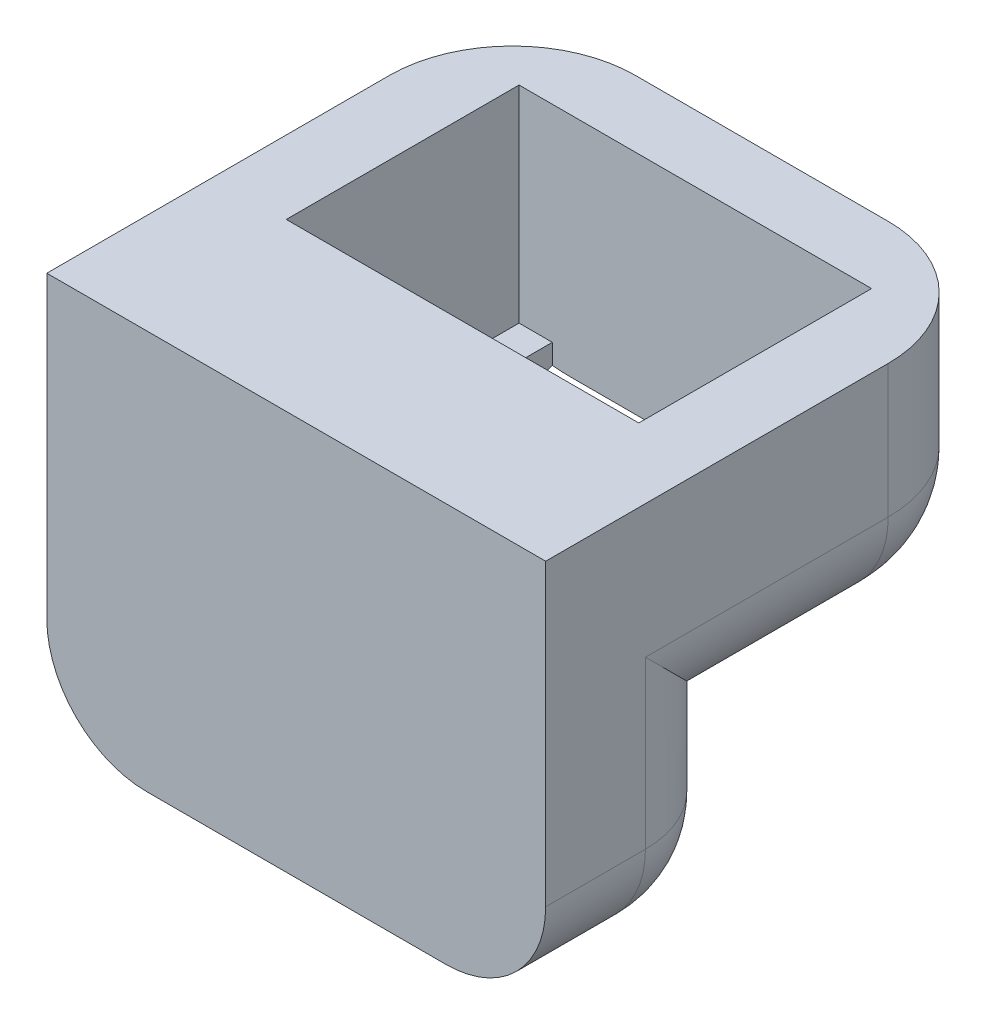
ISO-10303-21;
HEADER;
FILE_DESCRIPTION(('STEP AP214'),'2;1');
FILE_NAME('part.step','',(''),(''),'','','');
FILE_SCHEMA(('AUTOMOTIVE_DESIGN { 1 0 10303 214 1 1 1 1 }'));
ENDSEC;
DATA;
#1=APPLICATION_CONTEXT('core data for automotive mechanical design processes');
#2=APPLICATION_PROTOCOL_DEFINITION('international standard','automotive_design',2000,#1);
#3=PRODUCT_CONTEXT('',#1,'mechanical');
#4=PRODUCT('Part','Part','',(#3));
#5=PRODUCT_RELATED_PRODUCT_CATEGORY('part','',(#4));
#6=PRODUCT_DEFINITION_FORMATION('','',#4);
#7=PRODUCT_DEFINITION_CONTEXT('part definition',#1,'design');
#8=PRODUCT_DEFINITION('design','',#6,#7);
#9=PRODUCT_DEFINITION_SHAPE('','',#8);
#10=(LENGTH_UNIT() NAMED_UNIT(*) SI_UNIT(.MILLI.,.METRE.));
#11=(NAMED_UNIT(*) PLANE_ANGLE_UNIT() SI_UNIT($,.RADIAN.));
#12=(NAMED_UNIT(*) SI_UNIT($,.STERADIAN.) SOLID_ANGLE_UNIT());
#13=UNCERTAINTY_MEASURE_WITH_UNIT(LENGTH_MEASURE(1.E-05),#10,'distance_accuracy_value','');
#14=(GEOMETRIC_REPRESENTATION_CONTEXT(3) GLOBAL_UNCERTAINTY_ASSIGNED_CONTEXT((#13)) GLOBAL_UNIT_ASSIGNED_CONTEXT((#10,
#11,#12)) REPRESENTATION_CONTEXT('',''));
#15=CARTESIAN_POINT('',(0.,0.,0.));
#16=DIRECTION('',(0.,0.,1.));
#17=DIRECTION('',(1.,0.,0.));
#18=AXIS2_PLACEMENT_3D('',#15,#16,#17);
#19=CARTESIAN_POINT('',(0.,0.,0.));
#20=DIRECTION('',(0.,1.,0.));
#21=DIRECTION('',(0.,0.,1.));
#22=AXIS2_PLACEMENT_3D('',#19,#20,#21);
#23=PLANE('',#22);
#24=DIRECTION('',(1.,0.,0.));
#25=VECTOR('',#24,1.);
#26=CARTESIAN_POINT('',(-7.5,0.,1.));
#27=LINE('',#26,#25);
#28=CARTESIAN_POINT('',(-4.5,0.,1.));
#29=VERTEX_POINT('',#28);
#30=CARTESIAN_POINT('',(-4.3,0.,1.));
#31=VERTEX_POINT('',#30);
#32=EDGE_CURVE('E204',#29,#31,#27,.T.);
#33=ORIENTED_EDGE('',*,*,#32,.F.);
#34=DIRECTION('',(0.,0.,1.));
#35=VECTOR('',#34,1.);
#36=CARTESIAN_POINT('',(-4.5,0.,0.));
#37=LINE('',#36,#35);
#38=CARTESIAN_POINT('',(-4.5,0.,-3.3));
#39=VERTEX_POINT('',#38);
#40=EDGE_CURVE('E361',#29,#39,#37,.F.);
#41=ORIENTED_EDGE('',*,*,#40,.T.);
#42=CARTESIAN_POINT('',(-3.8,0.,-3.3));
#43=DIRECTION('',(0.,1.,0.));
#44=DIRECTION('',(0.,0.,1.));
#45=AXIS2_PLACEMENT_3D('',#42,#43,#44);
#46=CIRCLE('',#45,0.7);
#47=CARTESIAN_POINT('',(-4.3,0.,-3.78989794855663));
#48=VERTEX_POINT('',#47);
#49=EDGE_CURVE('E206',#39,#48,#46,.F.);
#50=ORIENTED_EDGE('',*,*,#49,.T.);
#51=DIRECTION('',(0.,0.,1.));
#52=VECTOR('',#51,1.);
#53=CARTESIAN_POINT('',(-4.3,0.,-5.));
#54=LINE('',#53,#52);
#55=EDGE_CURVE('E202',#48,#31,#54,.T.);
#56=ORIENTED_EDGE('',*,*,#55,.T.);
#57=EDGE_LOOP('',(#33,#41,#50,#56));
#58=FACE_BOUND('',#57,.T.);
#59=ADVANCED_FACE('F44',(#58),#23,.F.);
#60=CARTESIAN_POINT('',(3.8,0.,-3.3));
#61=DIRECTION('',(0.,1.,0.));
#62=DIRECTION('',(0.,0.,1.));
#63=AXIS2_PLACEMENT_3D('',#60,#61,#62);
#64=CIRCLE('',#63,0.7);
#65=CARTESIAN_POINT('',(4.3,0.,-3.78989794855664));
#66=VERTEX_POINT('',#65);
#67=CARTESIAN_POINT('',(4.5,0.,-3.3));
#68=VERTEX_POINT('',#67);
#69=EDGE_CURVE('E353',#66,#68,#64,.F.);
#70=ORIENTED_EDGE('',*,*,#69,.T.);
#71=DIRECTION('',(0.,0.,-1.));
#72=VECTOR('',#71,1.);
#73=CARTESIAN_POINT('',(4.5,0.,0.));
#74=LINE('',#73,#72);
#75=CARTESIAN_POINT('',(4.5,0.,1.));
#76=VERTEX_POINT('',#75);
#77=EDGE_CURVE('E357',#68,#76,#74,.F.);
#78=ORIENTED_EDGE('',*,*,#77,.T.);
#79=CARTESIAN_POINT('',(4.3,0.,1.));
#80=VERTEX_POINT('',#79);
#81=EDGE_CURVE('E227',#80,#76,#27,.T.);
#82=ORIENTED_EDGE('',*,*,#81,.F.);
#83=DIRECTION('',(0.,0.,-1.));
#84=VECTOR('',#83,1.);
#85=CARTESIAN_POINT('',(4.3,0.,-5.));
#86=LINE('',#85,#84);
#87=EDGE_CURVE('E214',#80,#66,#86,.T.);
#88=ORIENTED_EDGE('',*,*,#87,.T.);
#89=EDGE_LOOP('',(#70,#78,#82,#88));
#90=FACE_BOUND('',#89,.T.);
#91=ADVANCED_FACE('F447',(#90),#23,.F.);
#92=CARTESIAN_POINT('',(7.5,7.,-7.));
#93=DIRECTION('',(-1.,0.,0.));
#94=DIRECTION('',(0.,0.,1.));
#95=AXIS2_PLACEMENT_3D('',#92,#93,#94);
#96=PLANE('',#95);
#97=DIRECTION('',(0.,0.,1.));
#98=VECTOR('',#97,1.);
#99=CARTESIAN_POINT('',(7.5,-2.,-7.));
#100=LINE('',#99,#98);
#101=CARTESIAN_POINT('',(7.5,-2.,7.));
#102=VERTEX_POINT('',#101);
#103=CARTESIAN_POINT('',(7.5,-2.,4.));
#104=VERTEX_POINT('',#103);
#105=EDGE_CURVE('E350',#102,#104,#100,.F.);
#106=ORIENTED_EDGE('',*,*,#105,.T.);
#107=DIRECTION('',(0.,1.,0.));
#108=VECTOR('',#107,1.);
#109=CARTESIAN_POINT('',(7.5,7.,4.));
#110=LINE('',#109,#108);
#111=CARTESIAN_POINT('',(7.5,3.,4.));
#112=VERTEX_POINT('',#111);
#113=EDGE_CURVE('E532',#104,#112,#110,.T.);
#114=ORIENTED_EDGE('',*,*,#113,.T.);
#115=DIRECTION('',(0.,0.,-1.));
#116=VECTOR('',#115,1.);
#117=CARTESIAN_POINT('',(7.5,3.,-7.));
#118=LINE('',#117,#116);
#119=CARTESIAN_POINT('',(7.5,3.,-3.3));
#120=VERTEX_POINT('',#119);
#121=EDGE_CURVE('E68',#112,#120,#118,.T.);
#122=ORIENTED_EDGE('',*,*,#121,.T.);
#123=DIRECTION('',(0.,-1.,0.));
#124=VECTOR('',#123,1.);
#125=CARTESIAN_POINT('',(7.5,7.,-3.3));
#126=LINE('',#125,#124);
#127=CARTESIAN_POINT('',(7.5,7.,-3.3));
#128=VERTEX_POINT('',#127);
#129=EDGE_CURVE('E326',#120,#128,#126,.F.);
#130=ORIENTED_EDGE('',*,*,#129,.T.);
#131=DIRECTION('',(0.,0.,-1.));
#132=VECTOR('',#131,1.);
#133=CARTESIAN_POINT('',(7.5,7.,-7.));
#134=LINE('',#133,#132);
#135=CARTESIAN_POINT('',(7.5,7.,7.));
#136=VERTEX_POINT('',#135);
#137=EDGE_CURVE('E282',#136,#128,#134,.T.);
#138=ORIENTED_EDGE('',*,*,#137,.F.);
#139=DIRECTION('',(0.,-1.,0.));
#140=VECTOR('',#139,1.);
#141=CARTESIAN_POINT('',(7.5,7.,7.));
#142=LINE('',#141,#140);
#143=EDGE_CURVE('E302',#136,#102,#142,.T.);
#144=ORIENTED_EDGE('',*,*,#143,.T.);
#145=EDGE_LOOP('',(#106,#114,#122,#130,#138,#144));
#146=FACE_BOUND('',#145,.T.);
#147=ADVANCED_FACE('F448',(#146),#96,.F.);
#148=CARTESIAN_POINT('',(-7.5,7.,-7.));
#149=DIRECTION('',(0.,0.,1.));
#150=DIRECTION('',(1.,0.,0.));
#151=AXIS2_PLACEMENT_3D('',#148,#149,#150);
#152=PLANE('',#151);
#153=DIRECTION('',(0.,-1.,0.));
#154=VECTOR('',#153,1.);
#155=CARTESIAN_POINT('',(3.8,7.,-7.));
#156=LINE('',#155,#154);
#157=CARTESIAN_POINT('',(3.8,7.,-7.));
#158=VERTEX_POINT('',#157);
#159=CARTESIAN_POINT('',(3.8,3.,-7.));
#160=VERTEX_POINT('',#159);
#161=EDGE_CURVE('E317',#158,#160,#156,.T.);
#162=ORIENTED_EDGE('',*,*,#161,.T.);
#163=DIRECTION('',(-1.,0.,0.));
#164=VECTOR('',#163,1.);
#165=CARTESIAN_POINT('',(-7.5,3.,-7.));
#166=LINE('',#165,#164);
#167=CARTESIAN_POINT('',(-3.8,3.,-7.));
#168=VERTEX_POINT('',#167);
#169=EDGE_CURVE('E508',#160,#168,#166,.T.);
#170=ORIENTED_EDGE('',*,*,#169,.T.);
#171=DIRECTION('',(0.,-1.,0.));
#172=VECTOR('',#171,1.);
#173=CARTESIAN_POINT('',(-3.8,7.,-7.));
#174=LINE('',#173,#172);
#175=CARTESIAN_POINT('',(-3.8,7.,-7.));
#176=VERTEX_POINT('',#175);
#177=EDGE_CURVE('E318',#168,#176,#174,.F.);
#178=ORIENTED_EDGE('',*,*,#177,.T.);
#179=DIRECTION('',(-1.,0.,0.));
#180=VECTOR('',#179,1.);
#181=CARTESIAN_POINT('',(-7.5,7.,-7.));
#182=LINE('',#181,#180);
#183=EDGE_CURVE('E295',#158,#176,#182,.T.);
#184=ORIENTED_EDGE('',*,*,#183,.F.);
#185=EDGE_LOOP('',(#162,#170,#178,#184));
#186=FACE_BOUND('',#185,.T.);
#187=ADVANCED_FACE('F462',(#186),#152,.F.);
#188=CARTESIAN_POINT('',(-7.5,7.,-7.));
#189=DIRECTION('',(1.,0.,0.));
#190=DIRECTION('',(0.,0.,-1.));
#191=AXIS2_PLACEMENT_3D('',#188,#189,#190);
#192=PLANE('',#191);
#193=DIRECTION('',(0.,0.,1.));
#194=VECTOR('',#193,1.);
#195=CARTESIAN_POINT('',(-7.5,3.,-7.));
#196=LINE('',#195,#194);
#197=CARTESIAN_POINT('',(-7.5,3.,-3.3));
#198=VERTEX_POINT('',#197);
#199=CARTESIAN_POINT('',(-7.5,3.,4.));
#200=VERTEX_POINT('',#199);
#201=EDGE_CURVE('E351',#198,#200,#196,.T.);
#202=ORIENTED_EDGE('',*,*,#201,.T.);
#203=DIRECTION('',(0.,1.,0.));
#204=VECTOR('',#203,1.);
#205=CARTESIAN_POINT('',(-7.5,7.,4.));
#206=LINE('',#205,#204);
#207=CARTESIAN_POINT('',(-7.5,-2.,4.));
#208=VERTEX_POINT('',#207);
#209=EDGE_CURVE('E523',#200,#208,#206,.F.);
#210=ORIENTED_EDGE('',*,*,#209,.T.);
#211=DIRECTION('',(0.,0.,-1.));
#212=VECTOR('',#211,1.);
#213=CARTESIAN_POINT('',(-7.5,-2.,-7.));
#214=LINE('',#213,#212);
#215=CARTESIAN_POINT('',(-7.5,-2.,7.));
#216=VERTEX_POINT('',#215);
#217=EDGE_CURVE('E336',#208,#216,#214,.F.);
#218=ORIENTED_EDGE('',*,*,#217,.T.);
#219=DIRECTION('',(0.,-1.,0.));
#220=VECTOR('',#219,1.);
#221=CARTESIAN_POINT('',(-7.5,7.,7.));
#222=LINE('',#221,#220);
#223=CARTESIAN_POINT('',(-7.5,7.,7.));
#224=VERTEX_POINT('',#223);
#225=EDGE_CURVE('E308',#224,#216,#222,.T.);
#226=ORIENTED_EDGE('',*,*,#225,.F.);
#227=DIRECTION('',(0.,0.,1.));
#228=VECTOR('',#227,1.);
#229=CARTESIAN_POINT('',(-7.5,7.,-7.));
#230=LINE('',#229,#228);
#231=CARTESIAN_POINT('',(-7.5,7.,-3.3));
#232=VERTEX_POINT('',#231);
#233=EDGE_CURVE('E296',#232,#224,#230,.T.);
#234=ORIENTED_EDGE('',*,*,#233,.F.);
#235=DIRECTION('',(0.,-1.,0.));
#236=VECTOR('',#235,1.);
#237=CARTESIAN_POINT('',(-7.5,7.,-3.3));
#238=LINE('',#237,#236);
#239=EDGE_CURVE('E315',#232,#198,#238,.T.);
#240=ORIENTED_EDGE('',*,*,#239,.T.);
#241=EDGE_LOOP('',(#202,#210,#218,#226,#234,#240));
#242=FACE_BOUND('',#241,.T.);
#243=ADVANCED_FACE('F456',(#242),#192,.F.);
#244=CARTESIAN_POINT('',(-7.5,7.,7.));
#245=DIRECTION('',(0.,0.,-1.));
#246=DIRECTION('',(-1.,0.,0.));
#247=AXIS2_PLACEMENT_3D('',#244,#245,#246);
#248=PLANE('',#247);
#249=ORIENTED_EDGE('',*,*,#225,.T.);
#250=CARTESIAN_POINT('',(-4.5,-2.,7.));
#251=DIRECTION('',(0.,0.,-1.));
#252=DIRECTION('',(-1.,0.,0.));
#253=AXIS2_PLACEMENT_3D('',#250,#251,#252);
#254=CIRCLE('',#253,3.);
#255=CARTESIAN_POINT('',(-4.5,-5.,7.));
#256=VERTEX_POINT('',#255);
#257=EDGE_CURVE('E343',#216,#256,#254,.F.);
#258=ORIENTED_EDGE('',*,*,#257,.T.);
#259=DIRECTION('',(-1.,0.,0.));
#260=VECTOR('',#259,1.);
#261=CARTESIAN_POINT('',(-7.5,-5.,7.));
#262=LINE('',#261,#260);
#263=CARTESIAN_POINT('',(4.5,-5.,7.));
#264=VERTEX_POINT('',#263);
#265=EDGE_CURVE('E223',#264,#256,#262,.T.);
#266=ORIENTED_EDGE('',*,*,#265,.F.);
#267=CARTESIAN_POINT('',(4.5,-2.,7.));
#268=DIRECTION('',(0.,0.,-1.));
#269=DIRECTION('',(-1.,0.,0.));
#270=AXIS2_PLACEMENT_3D('',#267,#268,#269);
#271=CIRCLE('',#270,3.);
#272=EDGE_CURVE('E341',#264,#102,#271,.F.);
#273=ORIENTED_EDGE('',*,*,#272,.T.);
#274=ORIENTED_EDGE('',*,*,#143,.F.);
#275=DIRECTION('',(1.,0.,0.));
#276=VECTOR('',#275,1.);
#277=CARTESIAN_POINT('',(-7.5,7.,7.));
#278=LINE('',#277,#276);
#279=EDGE_CURVE('E301',#224,#136,#278,.T.);
#280=ORIENTED_EDGE('',*,*,#279,.F.);
#281=EDGE_LOOP('',(#249,#258,#266,#273,#274,#280));
#282=FACE_BOUND('',#281,.T.);
#283=ADVANCED_FACE('F457',(#282),#248,.F.);
#284=CARTESIAN_POINT('',(0.,7.,0.));
#285=DIRECTION('',(0.,1.,0.));
#286=DIRECTION('',(0.,0.,1.));
#287=AXIS2_PLACEMENT_3D('',#284,#285,#286);
#288=PLANE('',#287);
#289=DIRECTION('',(0.,0.,1.));
#290=VECTOR('',#289,1.);
#291=CARTESIAN_POINT('',(-5.3,7.,-5.));
#292=LINE('',#291,#290);
#293=CARTESIAN_POINT('',(-5.3,7.,-5.));
#294=VERTEX_POINT('',#293);
#295=CARTESIAN_POINT('',(-5.3,7.,2.));
#296=VERTEX_POINT('',#295);
#297=EDGE_CURVE('E261',#294,#296,#292,.T.);
#298=ORIENTED_EDGE('',*,*,#297,.F.);
#299=DIRECTION('',(-1.,0.,0.));
#300=VECTOR('',#299,1.);
#301=CARTESIAN_POINT('',(-5.3,7.,-5.));
#302=LINE('',#301,#300);
#303=CARTESIAN_POINT('',(5.3,7.,-5.));
#304=VERTEX_POINT('',#303);
#305=EDGE_CURVE('E252',#304,#294,#302,.T.);
#306=ORIENTED_EDGE('',*,*,#305,.F.);
#307=DIRECTION('',(0.,0.,-1.));
#308=VECTOR('',#307,1.);
#309=CARTESIAN_POINT('',(5.3,7.,-5.));
#310=LINE('',#309,#308);
#311=CARTESIAN_POINT('',(5.3,7.,2.));
#312=VERTEX_POINT('',#311);
#313=EDGE_CURVE('E272',#312,#304,#310,.T.);
#314=ORIENTED_EDGE('',*,*,#313,.F.);
#315=DIRECTION('',(1.,0.,0.));
#316=VECTOR('',#315,1.);
#317=CARTESIAN_POINT('',(-5.3,7.,2.));
#318=LINE('',#317,#316);
#319=EDGE_CURVE('E266',#296,#312,#318,.T.);
#320=ORIENTED_EDGE('',*,*,#319,.F.);
#321=EDGE_LOOP('',(#298,#306,#314,#320));
#322=FACE_BOUND('',#321,.T.);
#323=ORIENTED_EDGE('',*,*,#183,.T.);
#324=CARTESIAN_POINT('',(-3.8,7.,-3.3));
#325=DIRECTION('',(0.,1.,0.));
#326=DIRECTION('',(0.,0.,1.));
#327=AXIS2_PLACEMENT_3D('',#324,#325,#326);
#328=CIRCLE('',#327,3.7);
#329=EDGE_CURVE('E327',#176,#232,#328,.T.);
#330=ORIENTED_EDGE('',*,*,#329,.T.);
#331=ORIENTED_EDGE('',*,*,#233,.T.);
#332=ORIENTED_EDGE('',*,*,#279,.T.);
#333=ORIENTED_EDGE('',*,*,#137,.T.);
#334=CARTESIAN_POINT('',(3.8,7.,-3.3));
#335=DIRECTION('',(0.,1.,0.));
#336=DIRECTION('',(0.,0.,1.));
#337=AXIS2_PLACEMENT_3D('',#334,#335,#336);
#338=CIRCLE('',#337,3.7);
#339=EDGE_CURVE('E324',#128,#158,#338,.T.);
#340=ORIENTED_EDGE('',*,*,#339,.T.);
#341=EDGE_LOOP('',(#323,#330,#331,#332,#333,#340));
#342=FACE_BOUND('',#341,.T.);
#343=ADVANCED_FACE('F453',(#322,#342),#288,.T.);
#344=CARTESIAN_POINT('',(-3.8,7.,-3.3));
#345=DIRECTION('',(0.,-1.,0.));
#346=DIRECTION('',(0.,0.,-1.));
#347=AXIS2_PLACEMENT_3D('',#344,#345,#346);
#348=CYLINDRICAL_SURFACE('',#347,3.7);
#349=ORIENTED_EDGE('',*,*,#177,.F.);
#350=CARTESIAN_POINT('',(-3.8,3.,-3.3));
#351=DIRECTION('',(0.,1.,0.));
#352=DIRECTION('',(0.,0.,1.));
#353=AXIS2_PLACEMENT_3D('',#350,#351,#352);
#354=CIRCLE('',#353,3.7);
#355=EDGE_CURVE('E411',#168,#198,#354,.T.);
#356=ORIENTED_EDGE('',*,*,#355,.T.);
#357=ORIENTED_EDGE('',*,*,#239,.F.);
#358=ORIENTED_EDGE('',*,*,#329,.F.);
#359=EDGE_LOOP('',(#349,#356,#357,#358));
#360=FACE_BOUND('',#359,.T.);
#361=ADVANCED_FACE('F471',(#360),#348,.T.);
#362=CARTESIAN_POINT('',(3.8,7.,-3.3));
#363=DIRECTION('',(0.,-1.,0.));
#364=DIRECTION('',(0.,0.,-1.));
#365=AXIS2_PLACEMENT_3D('',#362,#363,#364);
#366=CYLINDRICAL_SURFACE('',#365,3.7);
#367=ORIENTED_EDGE('',*,*,#129,.F.);
#368=CARTESIAN_POINT('',(3.8,3.,-3.3));
#369=DIRECTION('',(0.,1.,0.));
#370=DIRECTION('',(0.,0.,1.));
#371=AXIS2_PLACEMENT_3D('',#368,#369,#370);
#372=CIRCLE('',#371,3.7);
#373=EDGE_CURVE('E430',#120,#160,#372,.T.);
#374=ORIENTED_EDGE('',*,*,#373,.T.);
#375=ORIENTED_EDGE('',*,*,#161,.F.);
#376=ORIENTED_EDGE('',*,*,#339,.F.);
#377=EDGE_LOOP('',(#367,#374,#375,#376));
#378=FACE_BOUND('',#377,.T.);
#379=ADVANCED_FACE('F473',(#378),#366,.T.);
#380=CARTESIAN_POINT('',(-5.3,0.8,-5.));
#381=DIRECTION('',(-1.,0.,0.));
#382=DIRECTION('',(0.,0.,1.));
#383=AXIS2_PLACEMENT_3D('',#380,#381,#382);
#384=PLANE('',#383);
#385=ORIENTED_EDGE('',*,*,#297,.T.);
#386=DIRECTION('',(0.,1.,0.));
#387=VECTOR('',#386,1.);
#388=CARTESIAN_POINT('',(-5.3,0.8,2.));
#389=LINE('',#388,#387);
#390=CARTESIAN_POINT('',(-5.3,0.8,2.));
#391=VERTEX_POINT('',#390);
#392=EDGE_CURVE('E264',#391,#296,#389,.T.);
#393=ORIENTED_EDGE('',*,*,#392,.F.);
#394=DIRECTION('',(0.,0.,1.));
#395=VECTOR('',#394,1.);
#396=CARTESIAN_POINT('',(-5.3,0.8,-5.));
#397=LINE('',#396,#395);
#398=CARTESIAN_POINT('',(-5.3,0.8,-5.));
#399=VERTEX_POINT('',#398);
#400=EDGE_CURVE('E246',#399,#391,#397,.T.);
#401=ORIENTED_EDGE('',*,*,#400,.F.);
#402=DIRECTION('',(0.,1.,0.));
#403=VECTOR('',#402,1.);
#404=CARTESIAN_POINT('',(-5.3,0.8,-5.));
#405=LINE('',#404,#403);
#406=EDGE_CURVE('E279',#399,#294,#405,.T.);
#407=ORIENTED_EDGE('',*,*,#406,.T.);
#408=EDGE_LOOP('',(#385,#393,#401,#407));
#409=FACE_BOUND('',#408,.T.);
#410=ADVANCED_FACE('F405',(#409),#384,.F.);
#411=CARTESIAN_POINT('',(-5.3,0.8,-5.));
#412=DIRECTION('',(0.,0.,-1.));
#413=DIRECTION('',(-1.,0.,0.));
#414=AXIS2_PLACEMENT_3D('',#411,#412,#413);
#415=PLANE('',#414);
#416=DIRECTION('',(0.,1.,0.));
#417=VECTOR('',#416,1.);
#418=CARTESIAN_POINT('',(-4.3,0.,-5.));
#419=LINE('',#418,#417);
#420=CARTESIAN_POINT('',(-4.3,0.19807096440083,-5.));
#421=VERTEX_POINT('',#420);
#422=CARTESIAN_POINT('',(-4.3,0.8,-5.));
#423=VERTEX_POINT('',#422);
#424=EDGE_CURVE('E270',#421,#423,#419,.T.);
#425=ORIENTED_EDGE('',*,*,#424,.F.);
#426=CARTESIAN_POINT('',(-4.30000000000002,0.19807096440083,-5.));
#427=CARTESIAN_POINT('',(-4.23434187750304,0.190994341747845,-5.));
#428=CARTESIAN_POINT('',(-4.16853288960308,0.185375020880761,-5.));
#429=CARTESIAN_POINT('',(-4.03673891919939,0.17695515346873,-5.));
#430=CARTESIAN_POINT('',(-3.97075394988533,0.174154401314055,-5.));
#431=CARTESIAN_POINT('',(-3.83922584714193,0.171285779875734,-5.));
#432=CARTESIAN_POINT('',(-3.77368316702003,0.171197302605498,-5.));
#433=CARTESIAN_POINT('',(-3.64265173526572,0.173703492364276,-5.));
#434=CARTESIAN_POINT('',(-3.57716298780833,0.176298350563394,-5.));
#435=CARTESIAN_POINT('',(-3.38081416743794,0.188217327262118,-5.));
#436=CARTESIAN_POINT('',(-3.25015746810453,0.201677857768439,-5.));
#437=CARTESIAN_POINT('',(-3.05510229977502,0.231147199538363,-5.));
#438=CARTESIAN_POINT('',(-2.98998792636088,0.242579418449711,-5.));
#439=CARTESIAN_POINT('',(-2.86041226146552,0.268758314925741,-5.));
#440=CARTESIAN_POINT('',(-2.79595115445608,0.283505902861825,-5.));
#441=CARTESIAN_POINT('',(-2.73191751838241,0.300007554481001,-5.));
#442=B_SPLINE_CURVE_WITH_KNOTS('',3,(#426,#427,#428,#429,#430,#431,#432,#433,#434,#435,#436,
#437,#438,#439,#440,#441),.UNSPECIFIED.,.F.,.F.,(4,2,2,2,2,2,2,4),(0.,0.198089244941023,
0.396164038565446,0.59273347493346,0.789316916553185,1.18274101062817,1.38099856919485,
1.57931063419709),.UNSPECIFIED.);
#443=CARTESIAN_POINT('',(-3.8,0.17157287525381,-5.));
#444=VERTEX_POINT('',#443);
#445=EDGE_CURVE('E407',#421,#444,#442,.T.);
#446=ORIENTED_EDGE('',*,*,#445,.T.);
#447=DIRECTION('',(-1.,0.,0.));
#448=VECTOR('',#447,1.);
#449=CARTESIAN_POINT('',(-7.5,0.17157287525381,-5.));
#450=LINE('',#449,#448);
#451=CARTESIAN_POINT('',(3.8,0.17157287525381,-5.));
#452=VERTEX_POINT('',#451);
#453=EDGE_CURVE('E413',#444,#452,#450,.F.);
#454=ORIENTED_EDGE('',*,*,#453,.T.);
#455=CARTESIAN_POINT('',(3.8,0.17157287525381,-5.));
#456=CARTESIAN_POINT('',(3.86239395008423,0.171583797795702,-5.));
#457=CARTESIAN_POINT('',(3.92479009210693,0.172787588831453,-5.));
#458=CARTESIAN_POINT('',(4.049498727336,0.177662060642244,-5.));
#459=CARTESIAN_POINT('',(4.11181119984117,0.181333267999243,-5.));
#460=CARTESIAN_POINT('',(4.23570615346567,0.19118153457391,-5.));
#461=CARTESIAN_POINT('',(4.29729032264637,0.197336914425952,-5.));
#462=CARTESIAN_POINT('',(4.42012936656057,0.212284479131018,-5.));
#463=CARTESIAN_POINT('',(4.48138425018053,0.221076592458961,-5.));
#464=CARTESIAN_POINT('',(4.66467284758286,0.25168274357145,-5.));
#465=CARTESIAN_POINT('',(4.78605827748488,0.277713830562597,-5.));
#466=CARTESIAN_POINT('',(4.96610492275004,0.326173567746536,-5.));
#467=CARTESIAN_POINT('',(5.02603605435792,0.343993232722421,-5.));
#468=CARTESIAN_POINT('',(5.1448562549897,0.382895392768182,-5.));
#469=CARTESIAN_POINT('',(5.2037448728144,0.4039792638855,-5.));
#470=CARTESIAN_POINT('',(5.26199901974969,0.426746667332608,-5.));
#471=B_SPLINE_CURVE_WITH_KNOTS('',3,(#455,#456,#457,#458,#459,#460,#461,#462,#463,#464,#465,
#466,#467,#468,#469,#470),.UNSPECIFIED.,.F.,.F.,(4,2,2,2,2,2,2,4),(0.,0.18717337966892,
0.374386717505526,0.560000404772037,0.745609057463236,1.11734278853023,1.30483500188099,
1.49240647010096),.UNSPECIFIED.);
#472=CARTESIAN_POINT('',(4.3,0.198070964400827,-5.));
#473=VERTEX_POINT('',#472);
#474=EDGE_CURVE('E374',#452,#473,#471,.T.);
#475=ORIENTED_EDGE('',*,*,#474,.T.);
#476=DIRECTION('',(0.,1.,0.));
#477=VECTOR('',#476,1.);
#478=CARTESIAN_POINT('',(4.3,0.,-5.));
#479=LINE('',#478,#477);
#480=CARTESIAN_POINT('',(4.3,0.8,-5.));
#481=VERTEX_POINT('',#480);
#482=EDGE_CURVE('E237',#473,#481,#479,.T.);
#483=ORIENTED_EDGE('',*,*,#482,.T.);
#484=DIRECTION('',(-1.,0.,0.));
#485=VECTOR('',#484,1.);
#486=CARTESIAN_POINT('',(-5.3,0.8,-5.));
#487=LINE('',#486,#485);
#488=CARTESIAN_POINT('',(5.3,0.8,-5.));
#489=VERTEX_POINT('',#488);
#490=EDGE_CURVE('E258',#489,#481,#487,.T.);
#491=ORIENTED_EDGE('',*,*,#490,.F.);
#492=DIRECTION('',(0.,1.,0.));
#493=VECTOR('',#492,1.);
#494=CARTESIAN_POINT('',(5.3,0.8,-5.));
#495=LINE('',#494,#493);
#496=EDGE_CURVE('E285',#489,#304,#495,.T.);
#497=ORIENTED_EDGE('',*,*,#496,.T.);
#498=ORIENTED_EDGE('',*,*,#305,.T.);
#499=ORIENTED_EDGE('',*,*,#406,.F.);
#500=EDGE_CURVE('E259',#423,#399,#487,.T.);
#501=ORIENTED_EDGE('',*,*,#500,.F.);
#502=EDGE_LOOP('',(#425,#446,#454,#475,#483,#491,#497,#498,#499,#501));
#503=FACE_BOUND('',#502,.T.);
#504=ADVANCED_FACE('F400',(#503),#415,.F.);
#505=CARTESIAN_POINT('',(5.3,0.8,-5.));
#506=DIRECTION('',(1.,0.,0.));
#507=DIRECTION('',(0.,0.,-1.));
#508=AXIS2_PLACEMENT_3D('',#505,#506,#507);
#509=PLANE('',#508);
#510=ORIENTED_EDGE('',*,*,#313,.T.);
#511=ORIENTED_EDGE('',*,*,#496,.F.);
#512=DIRECTION('',(0.,0.,-1.));
#513=VECTOR('',#512,1.);
#514=CARTESIAN_POINT('',(5.3,0.8,-5.));
#515=LINE('',#514,#513);
#516=CARTESIAN_POINT('',(5.3,0.8,2.));
#517=VERTEX_POINT('',#516);
#518=EDGE_CURVE('E253',#517,#489,#515,.T.);
#519=ORIENTED_EDGE('',*,*,#518,.F.);
#520=DIRECTION('',(0.,1.,0.));
#521=VECTOR('',#520,1.);
#522=CARTESIAN_POINT('',(5.3,0.8,2.));
#523=LINE('',#522,#521);
#524=EDGE_CURVE('E283',#517,#312,#523,.T.);
#525=ORIENTED_EDGE('',*,*,#524,.T.);
#526=EDGE_LOOP('',(#510,#511,#519,#525));
#527=FACE_BOUND('',#526,.T.);
#528=ADVANCED_FACE('F402',(#527),#509,.F.);
#529=CARTESIAN_POINT('',(-5.3,0.8,2.));
#530=DIRECTION('',(0.,0.,1.));
#531=DIRECTION('',(1.,0.,0.));
#532=AXIS2_PLACEMENT_3D('',#529,#530,#531);
#533=PLANE('',#532);
#534=ORIENTED_EDGE('',*,*,#319,.T.);
#535=ORIENTED_EDGE('',*,*,#524,.F.);
#536=DIRECTION('',(1.,0.,0.));
#537=VECTOR('',#536,1.);
#538=CARTESIAN_POINT('',(-5.3,0.8,2.));
#539=LINE('',#538,#537);
#540=EDGE_CURVE('E249',#391,#517,#539,.T.);
#541=ORIENTED_EDGE('',*,*,#540,.F.);
#542=ORIENTED_EDGE('',*,*,#392,.T.);
#543=EDGE_LOOP('',(#534,#535,#541,#542));
#544=FACE_BOUND('',#543,.T.);
#545=ADVANCED_FACE('F393',(#544),#533,.F.);
#546=CARTESIAN_POINT('',(0.,0.8,0.));
#547=DIRECTION('',(0.,1.,0.));
#548=DIRECTION('',(0.,0.,1.));
#549=AXIS2_PLACEMENT_3D('',#546,#547,#548);
#550=PLANE('',#549);
#551=DIRECTION('',(0.,0.,1.));
#552=VECTOR('',#551,1.);
#553=CARTESIAN_POINT('',(-4.3,0.8,-5.));
#554=LINE('',#553,#552);
#555=CARTESIAN_POINT('',(-4.3,0.8,1.));
#556=VERTEX_POINT('',#555);
#557=EDGE_CURVE('E229',#423,#556,#554,.T.);
#558=ORIENTED_EDGE('',*,*,#557,.F.);
#559=ORIENTED_EDGE('',*,*,#500,.T.);
#560=ORIENTED_EDGE('',*,*,#400,.T.);
#561=ORIENTED_EDGE('',*,*,#540,.T.);
#562=ORIENTED_EDGE('',*,*,#518,.T.);
#563=ORIENTED_EDGE('',*,*,#490,.T.);
#564=DIRECTION('',(0.,0.,-1.));
#565=VECTOR('',#564,1.);
#566=CARTESIAN_POINT('',(4.3,0.8,-5.));
#567=LINE('',#566,#565);
#568=CARTESIAN_POINT('',(4.3,0.8,1.));
#569=VERTEX_POINT('',#568);
#570=EDGE_CURVE('E213',#569,#481,#567,.T.);
#571=ORIENTED_EDGE('',*,*,#570,.F.);
#572=DIRECTION('',(1.,0.,0.));
#573=VECTOR('',#572,1.);
#574=CARTESIAN_POINT('',(-4.3,0.8,1.));
#575=LINE('',#574,#573);
#576=EDGE_CURVE('E577',#556,#569,#575,.T.);
#577=ORIENTED_EDGE('',*,*,#576,.F.);
#578=EDGE_LOOP('',(#558,#559,#560,#561,#562,#563,#571,#577));
#579=FACE_BOUND('',#578,.T.);
#580=ADVANCED_FACE('F395',(#579),#550,.T.);
#581=CARTESIAN_POINT('',(-4.3,0.,-5.));
#582=DIRECTION('',(-1.,0.,0.));
#583=DIRECTION('',(0.,0.,1.));
#584=AXIS2_PLACEMENT_3D('',#581,#582,#583);
#585=PLANE('',#584);
#586=ORIENTED_EDGE('',*,*,#55,.F.);
#587=CARTESIAN_POINT('',(-4.3,0.,-3.78989794855663));
#588=CARTESIAN_POINT('',(-4.3,-3.82827397660515E-06,-3.81940909509037));
#589=CARTESIAN_POINT('',(-4.3,0.000213681286812698,-3.84892076439548));
#590=CARTESIAN_POINT('',(-4.3,0.00117662524909447,-3.90793863113265));
#591=CARTESIAN_POINT('',(-4.3,0.00192212039614561,-3.93744482754429));
#592=CARTESIAN_POINT('',(-4.3,0.00507904681528521,-4.02595261528534));
#593=CARTESIAN_POINT('',(-4.3,0.00841102186889362,-4.08492600613572));
#594=CARTESIAN_POINT('',(-4.3,0.0178622721381985,-4.20180512699492));
#595=CARTESIAN_POINT('',(-4.3,0.023941046182228,-4.2597140733581));
#596=CARTESIAN_POINT('',(-4.3,0.0390734891364351,-4.37514080955667));
#597=CARTESIAN_POINT('',(-4.3,0.0481271090070544,-4.43265860582412));
#598=CARTESIAN_POINT('',(-4.3,0.07451053426522,-4.57515004705505));
#599=CARTESIAN_POINT('',(-4.3,0.0937222528094618,-4.65978445122284));
#600=CARTESIAN_POINT('',(-4.3,0.139119259798712,-4.82718778975752));
#601=CARTESIAN_POINT('',(-4.3,0.16530667902172,-4.90995614573362));
#602=CARTESIAN_POINT('',(-4.3,0.225234294001661,-5.07472225449229));
#603=CARTESIAN_POINT('',(-4.3,0.259123719604914,-5.15666588414509));
#604=CARTESIAN_POINT('',(-4.3,0.333926505044796,-5.31728932440555));
#605=CARTESIAN_POINT('',(-4.3,0.374840496234002,-5.39596884085195));
#606=CARTESIAN_POINT('',(-4.3,0.419166336165002,-5.47268597587277));
#607=B_SPLINE_CURVE_WITH_KNOTS('',3,(#587,#588,#589,#590,#591,#592,#593,#594,#595,#596,#597,
#598,#599,#600,#601,#602,#603,#604,#605,#606),.UNSPECIFIED.,.F.,.F.,(4,2,2,2,2,2,2,2,2,4),(0.,
0.0885327804773235,0.177075748443049,0.354213845881569,0.528821239108248,0.70342575412194,
0.963481174076332,1.22361612110297,1.48930150831873,1.75501078726788),.UNSPECIFIED.);
#608=EDGE_CURVE('E366',#48,#421,#607,.T.);
#609=ORIENTED_EDGE('',*,*,#608,.T.);
#610=ORIENTED_EDGE('',*,*,#424,.T.);
#611=ORIENTED_EDGE('',*,*,#557,.T.);
#612=DIRECTION('',(0.,1.,0.));
#613=VECTOR('',#612,1.);
#614=CARTESIAN_POINT('',(-4.3,0.,1.));
#615=LINE('',#614,#613);
#616=EDGE_CURVE('E216',#31,#556,#615,.T.);
#617=ORIENTED_EDGE('',*,*,#616,.F.);
#618=EDGE_LOOP('',(#586,#609,#610,#611,#617));
#619=FACE_BOUND('',#618,.T.);
#620=ADVANCED_FACE('F226',(#619),#585,.F.);
#621=CARTESIAN_POINT('',(4.3,0.,-5.));
#622=DIRECTION('',(1.,0.,0.));
#623=DIRECTION('',(0.,0.,-1.));
#624=AXIS2_PLACEMENT_3D('',#621,#622,#623);
#625=PLANE('',#624);
#626=ORIENTED_EDGE('',*,*,#482,.F.);
#627=CARTESIAN_POINT('',(4.3,0.198070964400827,-5.));
#628=CARTESIAN_POINT('',(4.3,0.171197639480702,-4.9268416555892));
#629=CARTESIAN_POINT('',(4.3,0.147144480999673,-4.8526474002672));
#630=CARTESIAN_POINT('',(4.3,0.104719376017938,-4.70291743690391));
#631=CARTESIAN_POINT('',(4.3,0.0863287477968276,-4.62738702861197));
#632=CARTESIAN_POINT('',(4.3,0.0629625263117327,-4.5135655439738));
#633=CARTESIAN_POINT('',(4.3,0.055897197676505,-4.47569123308868));
#634=CARTESIAN_POINT('',(4.3,0.0431028640340734,-4.39971140846034));
#635=CARTESIAN_POINT('',(4.3,0.0373740164983468,-4.36160586801457));
#636=CARTESIAN_POINT('',(4.3,0.0272159054763236,-4.28518289964994));
#637=CARTESIAN_POINT('',(4.3,0.0227879917964669,-4.24686529338919));
#638=CARTESIAN_POINT('',(4.3,0.0151872649804443,-4.170118394996));
#639=CARTESIAN_POINT('',(4.3,0.0120140692189212,-4.13168914051723));
#640=CARTESIAN_POINT('',(4.3,0.00641796033537794,-4.04843838547197));
#641=CARTESIAN_POINT('',(4.3,0.00420366584414757,-4.00360293412835));
#642=CARTESIAN_POINT('',(4.3,0.00117579685436567,-3.91388410125797));
#643=CARTESIAN_POINT('',(4.3,0.000362332201709846,-3.86900071624861));
#644=CARTESIAN_POINT('',(4.3,-0.000164701794535132,-3.77920096092735));
#645=CARTESIAN_POINT('',(4.3,0.000122452261906407,-3.73428458832784));
#646=CARTESIAN_POINT('',(4.3,0.00134172432635177,-3.64446062408607));
#647=CARTESIAN_POINT('',(4.3,0.00227388086988081,-3.59955303312884));
#648=CARTESIAN_POINT('',(4.3,0.00416161170999742,-3.50964790980413));
#649=CARTESIAN_POINT('',(4.3,0.00511722937367134,-3.4646503783781));
#650=CARTESIAN_POINT('',(4.3,0.00641135449419408,-3.3746502418361));
#651=CARTESIAN_POINT('',(4.3,0.00674994602375761,-3.329647638247));
#652=CARTESIAN_POINT('',(4.3,0.00656674363199382,-3.23963709995863));
#653=CARTESIAN_POINT('',(4.3,0.00604480565785465,-3.19462916562818));
#654=CARTESIAN_POINT('',(4.3,0.00451113909714124,-3.10461735111948));
#655=CARTESIAN_POINT('',(4.3,0.00349933949134367,-3.05961347247574));
#656=CARTESIAN_POINT('',(4.3,0.00163352192416619,-2.96871537172856));
#657=CARTESIAN_POINT('',(4.3,0.000783001247111659,-2.92282105897608));
#658=CARTESIAN_POINT('',(4.3,-0.00010724765383149,-2.83102584812557));
#659=CARTESIAN_POINT('',(4.3,-0.000147050207438798,-2.7851249510171));
#660=CARTESIAN_POINT('',(4.3,0.00102381196103286,-2.69339690756225));
#661=CARTESIAN_POINT('',(4.3,0.00223278402759761,-2.64756974549186));
#662=CARTESIAN_POINT('',(4.3,0.00617767102824513,-2.55598174184104));
#663=CARTESIAN_POINT('',(4.3,0.00891362492535039,-2.5102209019828));
#664=CARTESIAN_POINT('',(4.3,0.019668242298723,-2.37349281347494));
#665=CARTESIAN_POINT('',(4.3,0.0302350416616775,-2.28269925767086));
#666=CARTESIAN_POINT('',(4.3,0.0517621901617823,-2.14713592007811));
#667=CARTESIAN_POINT('',(4.3,0.059920176234942,-2.10190565514407));
#668=CARTESIAN_POINT('',(4.3,0.0781673168270505,-2.01182720699956));
#669=CARTESIAN_POINT('',(4.3,0.0882568593130682,-1.96697910244224));
#670=CARTESIAN_POINT('',(4.3,0.0993254166555046,-1.92236601584165));
#671=B_SPLINE_CURVE_WITH_KNOTS('',3,(#627,#628,#629,#630,#631,#632,#633,#634,#635,#636,#637,
#638,#639,#640,#641,#642,#643,#644,#645,#646,#647,#648,#649,#650,#651,#652,#653,#654,#655,#656,
#657,#658,#659,#660,#661,#662,#663,#664,#665,#666,#667,#668,#669,#670),.UNSPECIFIED.,.F.,.F.,(4,
2,2,2,2,2,2,2,2,2,2,2,2,2,2,2,2,2,2,2,2,4),(0.,0.233763567562517,0.466747431874154,
0.582310683824901,0.697887545197671,0.813583905245664,0.92924495650885,1.06388901134372,
1.19854362379453,1.33328675541069,1.4680379379194,1.60306040474544,1.73806447274896,
1.87309114275529,2.00813739454041,2.14584154049791,2.28353306115914,2.42103819201322,
2.55854683165855,2.83242437713088,2.97026839390324,3.10814012674683),.UNSPECIFIED.);
#672=EDGE_CURVE('E419',#473,#66,#671,.T.);
#673=ORIENTED_EDGE('',*,*,#672,.T.);
#674=ORIENTED_EDGE('',*,*,#87,.F.);
#675=DIRECTION('',(0.,1.,0.));
#676=VECTOR('',#675,1.);
#677=CARTESIAN_POINT('',(4.3,0.,1.));
#678=LINE('',#677,#676);
#679=EDGE_CURVE('E231',#80,#569,#678,.T.);
#680=ORIENTED_EDGE('',*,*,#679,.T.);
#681=ORIENTED_EDGE('',*,*,#570,.T.);
#682=EDGE_LOOP('',(#626,#673,#674,#680,#681));
#683=FACE_BOUND('',#682,.T.);
#684=ADVANCED_FACE('F392',(#683),#625,.F.);
#685=CARTESIAN_POINT('',(-4.3,0.,1.));
#686=DIRECTION('',(0.,0.,1.));
#687=DIRECTION('',(1.,0.,0.));
#688=AXIS2_PLACEMENT_3D('',#685,#686,#687);
#689=PLANE('',#688);
#690=DIRECTION('',(1.,0.,0.));
#691=VECTOR('',#690,1.);
#692=CARTESIAN_POINT('',(-4.3,-2.,1.));
#693=LINE('',#692,#691);
#694=CARTESIAN_POINT('',(4.5,-2.,1.));
#695=VERTEX_POINT('',#694);
#696=CARTESIAN_POINT('',(-4.5,-2.,1.));
#697=VERTEX_POINT('',#696);
#698=EDGE_CURVE('E517',#695,#697,#693,.F.);
#699=ORIENTED_EDGE('',*,*,#698,.T.);
#700=DIRECTION('',(0.,1.,0.));
#701=VECTOR('',#700,1.);
#702=CARTESIAN_POINT('',(-4.5,0.,1.));
#703=LINE('',#702,#701);
#704=EDGE_CURVE('E225',#697,#29,#703,.T.);
#705=ORIENTED_EDGE('',*,*,#704,.T.);
#706=ORIENTED_EDGE('',*,*,#32,.T.);
#707=ORIENTED_EDGE('',*,*,#616,.T.);
#708=ORIENTED_EDGE('',*,*,#576,.T.);
#709=ORIENTED_EDGE('',*,*,#679,.F.);
#710=ORIENTED_EDGE('',*,*,#81,.T.);
#711=DIRECTION('',(0.,1.,0.));
#712=VECTOR('',#711,1.);
#713=CARTESIAN_POINT('',(4.5,0.,1.));
#714=LINE('',#713,#712);
#715=EDGE_CURVE('E520',#76,#695,#714,.F.);
#716=ORIENTED_EDGE('',*,*,#715,.T.);
#717=EDGE_LOOP('',(#699,#705,#706,#707,#708,#709,#710,#716));
#718=FACE_BOUND('',#717,.T.);
#719=ADVANCED_FACE('F219',(#718),#689,.F.);
#720=CARTESIAN_POINT('',(0.,-5.,0.));
#721=DIRECTION('',(0.,1.,0.));
#722=DIRECTION('',(0.,0.,1.));
#723=AXIS2_PLACEMENT_3D('',#720,#721,#722);
#724=PLANE('',#723);
#725=DIRECTION('',(0.,0.,-1.));
#726=VECTOR('',#725,1.);
#727=CARTESIAN_POINT('',(-4.5,-5.,0.));
#728=LINE('',#727,#726);
#729=CARTESIAN_POINT('',(-4.5,-5.,4.));
#730=VERTEX_POINT('',#729);
#731=EDGE_CURVE('E334',#256,#730,#728,.T.);
#732=ORIENTED_EDGE('',*,*,#731,.T.);
#733=DIRECTION('',(1.,0.,0.));
#734=VECTOR('',#733,1.);
#735=CARTESIAN_POINT('',(0.,-5.,4.));
#736=LINE('',#735,#734);
#737=CARTESIAN_POINT('',(4.5,-5.,4.));
#738=VERTEX_POINT('',#737);
#739=EDGE_CURVE('E64',#730,#738,#736,.T.);
#740=ORIENTED_EDGE('',*,*,#739,.T.);
#741=DIRECTION('',(0.,0.,1.));
#742=VECTOR('',#741,1.);
#743=CARTESIAN_POINT('',(4.5,-5.,0.));
#744=LINE('',#743,#742);
#745=EDGE_CURVE('E335',#738,#264,#744,.T.);
#746=ORIENTED_EDGE('',*,*,#745,.T.);
#747=ORIENTED_EDGE('',*,*,#265,.T.);
#748=EDGE_LOOP('',(#732,#740,#746,#747));
#749=FACE_BOUND('',#748,.T.);
#750=ADVANCED_FACE('F436',(#749),#724,.F.);
#751=CARTESIAN_POINT('',(-4.5,-2.,0.));
#752=DIRECTION('',(0.,0.,-1.));
#753=DIRECTION('',(-1.,0.,0.));
#754=AXIS2_PLACEMENT_3D('',#751,#752,#753);
#755=CYLINDRICAL_SURFACE('',#754,3.);
#756=ORIENTED_EDGE('',*,*,#217,.F.);
#757=CARTESIAN_POINT('',(-4.5,-2.,4.));
#758=DIRECTION('',(0.,0.,-1.));
#759=DIRECTION('',(-1.,0.,0.));
#760=AXIS2_PLACEMENT_3D('',#757,#758,#759);
#761=CIRCLE('',#760,3.);
#762=EDGE_CURVE('E527',#208,#730,#761,.F.);
#763=ORIENTED_EDGE('',*,*,#762,.T.);
#764=ORIENTED_EDGE('',*,*,#731,.F.);
#765=ORIENTED_EDGE('',*,*,#257,.F.);
#766=EDGE_LOOP('',(#756,#763,#764,#765));
#767=FACE_BOUND('',#766,.T.);
#768=ADVANCED_FACE('F438',(#767),#755,.T.);
#769=CARTESIAN_POINT('',(4.5,-2.,0.));
#770=DIRECTION('',(0.,0.,1.));
#771=DIRECTION('',(1.,0.,0.));
#772=AXIS2_PLACEMENT_3D('',#769,#770,#771);
#773=CYLINDRICAL_SURFACE('',#772,3.);
#774=ORIENTED_EDGE('',*,*,#745,.F.);
#775=CARTESIAN_POINT('',(4.5,-2.,4.));
#776=DIRECTION('',(0.,0.,1.));
#777=DIRECTION('',(1.,0.,0.));
#778=AXIS2_PLACEMENT_3D('',#775,#776,#777);
#779=CIRCLE('',#778,3.);
#780=EDGE_CURVE('E534',#738,#104,#779,.T.);
#781=ORIENTED_EDGE('',*,*,#780,.T.);
#782=ORIENTED_EDGE('',*,*,#105,.F.);
#783=ORIENTED_EDGE('',*,*,#272,.F.);
#784=EDGE_LOOP('',(#774,#781,#782,#783));
#785=FACE_BOUND('',#784,.T.);
#786=ADVANCED_FACE('F445',(#785),#773,.T.);
#787=CARTESIAN_POINT('',(4.5,3.,-7.));
#788=DIRECTION('',(0.,0.,-1.));
#789=DIRECTION('',(-1.,0.,0.));
#790=AXIS2_PLACEMENT_3D('',#787,#788,#789);
#791=CYLINDRICAL_SURFACE('',#790,3.);
#792=ORIENTED_EDGE('',*,*,#121,.F.);
#793=CARTESIAN_POINT('',(4.5,3.,4.));
#794=DIRECTION('',(0.,0.707106781186547,-0.707106781186547));
#795=DIRECTION('',(0.,0.707106781186547,0.707106781186547));
#796=AXIS2_PLACEMENT_3D('',#793,#794,#795);
#797=ELLIPSE('',#796,4.24264068711928,3.);
#798=EDGE_CURVE('E11',#112,#76,#797,.T.);
#799=ORIENTED_EDGE('',*,*,#798,.T.);
#800=ORIENTED_EDGE('',*,*,#77,.F.);
#801=CARTESIAN_POINT('',(4.5,3.,-3.3));
#802=DIRECTION('',(0.,0.,-1.));
#803=DIRECTION('',(-1.,0.,0.));
#804=AXIS2_PLACEMENT_3D('',#801,#802,#803);
#805=CIRCLE('',#804,3.);
#806=EDGE_CURVE('E224',#120,#68,#805,.T.);
#807=ORIENTED_EDGE('',*,*,#806,.F.);
#808=EDGE_LOOP('',(#792,#799,#800,#807));
#809=FACE_BOUND('',#808,.T.);
#810=ADVANCED_FACE('F478',(#809),#791,.T.);
#811=CARTESIAN_POINT('',(3.8,3.,-3.3));
#812=DIRECTION('',(0.,1.,0.));
#813=DIRECTION('',(0.,0.,1.));
#814=AXIS2_PLACEMENT_3D('',#811,#812,#813);
#815=DEGENERATE_TOROIDAL_SURFACE('',#814,0.7,3.,.T.);
#816=ORIENTED_EDGE('',*,*,#672,.F.);
#817=ORIENTED_EDGE('',*,*,#474,.F.);
#818=CARTESIAN_POINT('',(3.8,3.,-4.));
#819=DIRECTION('',(-1.,0.,0.));
#820=DIRECTION('',(0.,0.,1.));
#821=AXIS2_PLACEMENT_3D('',#818,#819,#820);
#822=CIRCLE('',#821,3.);
#823=EDGE_CURVE('E502',#160,#452,#822,.T.);
#824=ORIENTED_EDGE('',*,*,#823,.F.);
#825=ORIENTED_EDGE('',*,*,#373,.F.);
#826=ORIENTED_EDGE('',*,*,#806,.T.);
#827=ORIENTED_EDGE('',*,*,#69,.F.);
#828=EDGE_LOOP('',(#816,#817,#824,#825,#826,#827));
#829=FACE_BOUND('',#828,.T.);
#830=ADVANCED_FACE('F429',(#829),#815,.T.);
#831=CARTESIAN_POINT('',(-7.5,3.,-4.));
#832=DIRECTION('',(-1.,0.,0.));
#833=DIRECTION('',(0.,0.,1.));
#834=AXIS2_PLACEMENT_3D('',#831,#832,#833);
#835=CYLINDRICAL_SURFACE('',#834,3.);
#836=ORIENTED_EDGE('',*,*,#823,.T.);
#837=ORIENTED_EDGE('',*,*,#453,.F.);
#838=CARTESIAN_POINT('',(-3.8,3.,-4.));
#839=DIRECTION('',(-1.,0.,0.));
#840=DIRECTION('',(0.,0.,1.));
#841=AXIS2_PLACEMENT_3D('',#838,#839,#840);
#842=CIRCLE('',#841,3.);
#843=EDGE_CURVE('E497',#168,#444,#842,.T.);
#844=ORIENTED_EDGE('',*,*,#843,.F.);
#845=ORIENTED_EDGE('',*,*,#169,.F.);
#846=EDGE_LOOP('',(#836,#837,#844,#845));
#847=FACE_BOUND('',#846,.T.);
#848=ADVANCED_FACE('F489',(#847),#835,.T.);
#849=CARTESIAN_POINT('',(-3.8,3.,-3.3));
#850=DIRECTION('',(0.,1.,0.));
#851=DIRECTION('',(0.,0.,1.));
#852=AXIS2_PLACEMENT_3D('',#849,#850,#851);
#853=DEGENERATE_TOROIDAL_SURFACE('',#852,0.7,3.,.T.);
#854=ORIENTED_EDGE('',*,*,#608,.F.);
#855=ORIENTED_EDGE('',*,*,#49,.F.);
#856=CARTESIAN_POINT('',(-4.5,3.,-3.3));
#857=DIRECTION('',(0.,0.,1.));
#858=DIRECTION('',(1.,0.,0.));
#859=AXIS2_PLACEMENT_3D('',#856,#857,#858);
#860=CIRCLE('',#859,3.);
#861=EDGE_CURVE('E492',#198,#39,#860,.T.);
#862=ORIENTED_EDGE('',*,*,#861,.F.);
#863=ORIENTED_EDGE('',*,*,#355,.F.);
#864=ORIENTED_EDGE('',*,*,#843,.T.);
#865=ORIENTED_EDGE('',*,*,#445,.F.);
#866=EDGE_LOOP('',(#854,#855,#862,#863,#864,#865));
#867=FACE_BOUND('',#866,.T.);
#868=ADVANCED_FACE('F384',(#867),#853,.T.);
#869=CARTESIAN_POINT('',(-4.5,3.,-7.));
#870=DIRECTION('',(0.,0.,1.));
#871=DIRECTION('',(1.,0.,0.));
#872=AXIS2_PLACEMENT_3D('',#869,#870,#871);
#873=CYLINDRICAL_SURFACE('',#872,3.);
#874=ORIENTED_EDGE('',*,*,#861,.T.);
#875=ORIENTED_EDGE('',*,*,#40,.F.);
#876=CARTESIAN_POINT('',(-4.5,3.,4.));
#877=DIRECTION('',(0.,0.707106781186547,-0.707106781186547));
#878=DIRECTION('',(0.,0.707106781186547,0.707106781186547));
#879=AXIS2_PLACEMENT_3D('',#876,#877,#878);
#880=ELLIPSE('',#879,4.24264068711928,3.);
#881=EDGE_CURVE('E54',#29,#200,#880,.T.);
#882=ORIENTED_EDGE('',*,*,#881,.T.);
#883=ORIENTED_EDGE('',*,*,#201,.F.);
#884=EDGE_LOOP('',(#874,#875,#882,#883));
#885=FACE_BOUND('',#884,.T.);
#886=ADVANCED_FACE('F485',(#885),#873,.T.);
#887=CARTESIAN_POINT('',(4.5,7.,4.));
#888=DIRECTION('',(0.,1.,0.));
#889=DIRECTION('',(0.,0.,1.));
#890=AXIS2_PLACEMENT_3D('',#887,#888,#889);
#891=CYLINDRICAL_SURFACE('',#890,3.);
#892=ORIENTED_EDGE('',*,*,#798,.F.);
#893=ORIENTED_EDGE('',*,*,#113,.F.);
#894=CARTESIAN_POINT('',(4.5,-2.,4.));
#895=DIRECTION('',(0.,-1.,0.));
#896=DIRECTION('',(0.,0.,-1.));
#897=AXIS2_PLACEMENT_3D('',#894,#895,#896);
#898=CIRCLE('',#897,3.);
#899=EDGE_CURVE('E47',#695,#104,#898,.T.);
#900=ORIENTED_EDGE('',*,*,#899,.F.);
#901=ORIENTED_EDGE('',*,*,#715,.F.);
#902=EDGE_LOOP('',(#892,#893,#900,#901));
#903=FACE_BOUND('',#902,.T.);
#904=ADVANCED_FACE('F50',(#903),#891,.T.);
#905=CARTESIAN_POINT('',(4.5,-2.,4.));
#906=DIRECTION('',(0.,0.,1.));
#907=DIRECTION('',(1.,0.,0.));
#908=AXIS2_PLACEMENT_3D('',#905,#906,#907);
#909=SPHERICAL_SURFACE('',#908,3.);
#910=ORIENTED_EDGE('',*,*,#899,.T.);
#911=ORIENTED_EDGE('',*,*,#780,.F.);
#912=CARTESIAN_POINT('',(4.5,-2.,4.));
#913=DIRECTION('',(-1.,0.,0.));
#914=DIRECTION('',(0.,0.,1.));
#915=AXIS2_PLACEMENT_3D('',#912,#913,#914);
#916=CIRCLE('',#915,3.);
#917=EDGE_CURVE('E507',#695,#738,#916,.T.);
#918=ORIENTED_EDGE('',*,*,#917,.F.);
#919=EDGE_LOOP('',(#910,#911,#918));
#920=FACE_BOUND('',#919,.T.);
#921=ADVANCED_FACE('F486',(#920),#909,.T.);
#922=CARTESIAN_POINT('',(0.,-2.,4.));
#923=DIRECTION('',(1.,0.,0.));
#924=DIRECTION('',(0.,0.,-1.));
#925=AXIS2_PLACEMENT_3D('',#922,#923,#924);
#926=CYLINDRICAL_SURFACE('',#925,3.);
#927=ORIENTED_EDGE('',*,*,#917,.T.);
#928=ORIENTED_EDGE('',*,*,#739,.F.);
#929=CARTESIAN_POINT('',(-4.5,-2.,4.));
#930=DIRECTION('',(-1.,0.,0.));
#931=DIRECTION('',(0.,0.,1.));
#932=AXIS2_PLACEMENT_3D('',#929,#930,#931);
#933=CIRCLE('',#932,3.);
#934=EDGE_CURVE('E543',#697,#730,#933,.T.);
#935=ORIENTED_EDGE('',*,*,#934,.F.);
#936=ORIENTED_EDGE('',*,*,#698,.F.);
#937=EDGE_LOOP('',(#927,#928,#935,#936));
#938=FACE_BOUND('',#937,.T.);
#939=ADVANCED_FACE('F555',(#938),#926,.T.);
#940=CARTESIAN_POINT('',(-4.5,-2.,4.));
#941=DIRECTION('',(0.,0.,1.));
#942=DIRECTION('',(1.,0.,0.));
#943=AXIS2_PLACEMENT_3D('',#940,#941,#942);
#944=SPHERICAL_SURFACE('',#943,3.);
#945=ORIENTED_EDGE('',*,*,#934,.T.);
#946=ORIENTED_EDGE('',*,*,#762,.F.);
#947=CARTESIAN_POINT('',(-4.5,-2.,4.));
#948=DIRECTION('',(0.,1.,0.));
#949=DIRECTION('',(-1.,0.,0.));
#950=AXIS2_PLACEMENT_3D('',#947,#948,#949);
#951=CIRCLE('',#950,3.);
#952=EDGE_CURVE('E542',#697,#208,#951,.T.);
#953=ORIENTED_EDGE('',*,*,#952,.F.);
#954=EDGE_LOOP('',(#945,#946,#953));
#955=FACE_BOUND('',#954,.T.);
#956=ADVANCED_FACE('F619',(#955),#944,.T.);
#957=CARTESIAN_POINT('',(-4.5,0.,4.));
#958=DIRECTION('',(0.,1.,0.));
#959=DIRECTION('',(0.,0.,1.));
#960=AXIS2_PLACEMENT_3D('',#957,#958,#959);
#961=CYLINDRICAL_SURFACE('',#960,3.);
#962=ORIENTED_EDGE('',*,*,#952,.T.);
#963=ORIENTED_EDGE('',*,*,#209,.F.);
#964=ORIENTED_EDGE('',*,*,#881,.F.);
#965=ORIENTED_EDGE('',*,*,#704,.F.);
#966=EDGE_LOOP('',(#962,#963,#964,#965));
#967=FACE_BOUND('',#966,.T.);
#968=ADVANCED_FACE('F621',(#967),#961,.T.);
#969=CLOSED_SHELL('',(#59,#91,#147,#187,#243,#283,#343,#361,#379,#410,#504,#528,#545,#580,#620,
#684,#719,#750,#768,#786,#810,#830,#848,#868,#886,#904,#921,#939,#956,#968));
#970=MANIFOLD_SOLID_BREP('B2',#969);
#971=ADVANCED_BREP_SHAPE_REPRESENTATION('',(#18,#970),#14);
#972=SHAPE_DEFINITION_REPRESENTATION(#9,#971);
ENDSEC;
END-ISO-10303-21;
